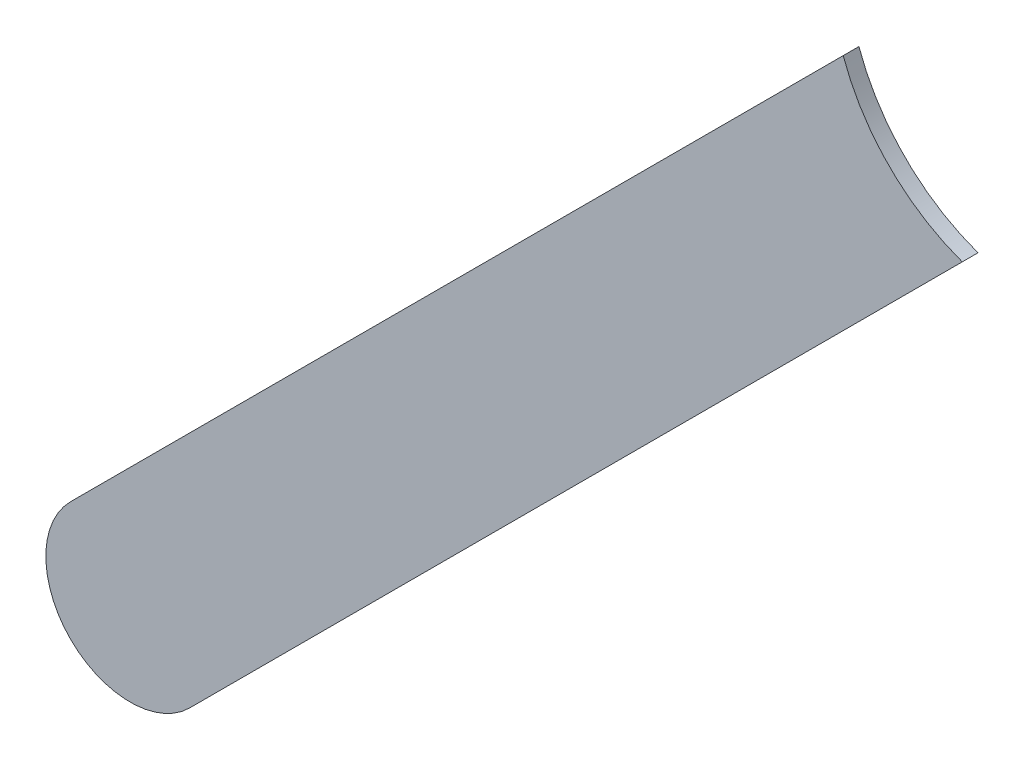
ISO-10303-21;
HEADER;
FILE_DESCRIPTION(('STEP AP214'),'2;1');
FILE_NAME('part.step','',(''),(''),'','','');
FILE_SCHEMA(('AUTOMOTIVE_DESIGN { 1 0 10303 214 1 1 1 1 }'));
ENDSEC;
DATA;
#1=APPLICATION_CONTEXT('core data for automotive mechanical design processes');
#2=APPLICATION_PROTOCOL_DEFINITION('international standard','automotive_design',2000,#1);
#3=PRODUCT_CONTEXT('',#1,'mechanical');
#4=PRODUCT('Part','Part','',(#3));
#5=PRODUCT_RELATED_PRODUCT_CATEGORY('part','',(#4));
#6=PRODUCT_DEFINITION_FORMATION('','',#4);
#7=PRODUCT_DEFINITION_CONTEXT('part definition',#1,'design');
#8=PRODUCT_DEFINITION('design','',#6,#7);
#9=PRODUCT_DEFINITION_SHAPE('','',#8);
#10=(LENGTH_UNIT() NAMED_UNIT(*) SI_UNIT(.MILLI.,.METRE.));
#11=(NAMED_UNIT(*) PLANE_ANGLE_UNIT() SI_UNIT($,.RADIAN.));
#12=(NAMED_UNIT(*) SI_UNIT($,.STERADIAN.) SOLID_ANGLE_UNIT());
#13=UNCERTAINTY_MEASURE_WITH_UNIT(LENGTH_MEASURE(1.E-05),#10,'distance_accuracy_value','');
#14=(GEOMETRIC_REPRESENTATION_CONTEXT(3) GLOBAL_UNCERTAINTY_ASSIGNED_CONTEXT((#13)) GLOBAL_UNIT_ASSIGNED_CONTEXT((#10,
#11,#12)) REPRESENTATION_CONTEXT('',''));
#15=CARTESIAN_POINT('',(0.,0.,0.));
#16=DIRECTION('',(0.,0.,1.));
#17=DIRECTION('',(1.,0.,0.));
#18=AXIS2_PLACEMENT_3D('',#15,#16,#17);
#19=CARTESIAN_POINT('',(29.337,11.303,0.));
#20=DIRECTION('',(0.,0.,-1.));
#21=DIRECTION('',(-0.707106781186552,0.707106781186543,0.));
#22=AXIS2_PLACEMENT_3D('',#19,#20,#21);
#23=CYLINDRICAL_SURFACE('',#22,0.190499969147466);
#24=CARTESIAN_POINT('',(29.337,11.303,0.03556));
#25=DIRECTION('',(0.,0.,1.));
#26=DIRECTION('',(-0.707106781186552,0.707106781186543,0.));
#27=AXIS2_PLACEMENT_3D('',#24,#25,#26);
#28=CIRCLE('',#27,0.190499969147466);
#29=CARTESIAN_POINT('',(29.20229618,11.43770382,0.03556));
#30=VERTEX_POINT('',#29);
#31=CARTESIAN_POINT('',(29.47170382,11.16829618,0.03556));
#32=VERTEX_POINT('',#31);
#33=EDGE_CURVE('E11',#30,#32,#28,.T.);
#34=ORIENTED_EDGE('',*,*,#33,.F.);
#35=DIRECTION('',(0.,0.,1.));
#36=VECTOR('',#35,1.);
#37=CARTESIAN_POINT('',(29.20229618,11.43770382,0.));
#38=LINE('',#37,#36);
#39=CARTESIAN_POINT('',(29.20229618,11.43770382,0.));
#40=VERTEX_POINT('',#39);
#41=EDGE_CURVE('E23',#40,#30,#38,.T.);
#42=ORIENTED_EDGE('',*,*,#41,.F.);
#43=CARTESIAN_POINT('',(29.337,11.303,0.));
#44=DIRECTION('',(0.,0.,1.));
#45=DIRECTION('',(-0.707106781186552,0.707106781186543,0.));
#46=AXIS2_PLACEMENT_3D('',#43,#44,#45);
#47=CIRCLE('',#46,0.190499969147466);
#48=CARTESIAN_POINT('',(29.47170382,11.16829618,0.));
#49=VERTEX_POINT('',#48);
#50=EDGE_CURVE('E87',#40,#49,#47,.T.);
#51=ORIENTED_EDGE('',*,*,#50,.T.);
#52=DIRECTION('',(0.,0.,1.));
#53=VECTOR('',#52,1.);
#54=CARTESIAN_POINT('',(29.47170382,11.16829618,0.));
#55=LINE('',#54,#53);
#56=EDGE_CURVE('E36',#49,#32,#55,.T.);
#57=ORIENTED_EDGE('',*,*,#56,.T.);
#58=EDGE_LOOP('',(#34,#42,#51,#57));
#59=FACE_BOUND('',#58,.T.);
#60=ADVANCED_FACE('F16',(#59),#23,.T.);
#61=CARTESIAN_POINT('',(30.9503155365093,13.1857231765093,0.));
#62=DIRECTION('',(0.707106781186547,-0.707106781186548,0.));
#63=DIRECTION('',(-0.707106781186548,-0.707106781186547,0.));
#64=AXIS2_PLACEMENT_3D('',#61,#62,#63);
#65=PLANE('',#64);
#66=DIRECTION('',(-0.707106781186548,-0.707106781186547,0.));
#67=VECTOR('',#66,1.);
#68=CARTESIAN_POINT('',(31.23429618,13.46970382,0.03556));
#69=LINE('',#68,#67);
#70=CARTESIAN_POINT('',(30.9503155365093,13.1857231765093,0.03556));
#71=VERTEX_POINT('',#70);
#72=EDGE_CURVE('E83',#71,#30,#69,.T.);
#73=ORIENTED_EDGE('',*,*,#72,.F.);
#74=DIRECTION('',(0.,0.,1.));
#75=VECTOR('',#74,1.);
#76=CARTESIAN_POINT('',(30.9503155365093,13.1857231765093,0.));
#77=LINE('',#76,#75);
#78=CARTESIAN_POINT('',(30.9503155365093,13.1857231765093,0.));
#79=VERTEX_POINT('',#78);
#80=EDGE_CURVE('E81',#79,#71,#77,.T.);
#81=ORIENTED_EDGE('',*,*,#80,.F.);
#82=DIRECTION('',(-0.707106781186548,-0.707106781186547,0.));
#83=VECTOR('',#82,1.);
#84=CARTESIAN_POINT('',(31.23429618,13.46970382,0.));
#85=LINE('',#84,#83);
#86=EDGE_CURVE('E72',#79,#40,#85,.T.);
#87=ORIENTED_EDGE('',*,*,#86,.T.);
#88=ORIENTED_EDGE('',*,*,#41,.T.);
#89=EDGE_LOOP('',(#73,#81,#87,#88));
#90=FACE_BOUND('',#89,.T.);
#91=ADVANCED_FACE('F88',(#90),#65,.F.);
#92=CARTESIAN_POINT('',(31.369,13.335,0.));
#93=DIRECTION('',(0.,0.,-1.));
#94=DIRECTION('',(1.,0.,0.));
#95=AXIS2_PLACEMENT_3D('',#92,#93,#94);
#96=CYLINDRICAL_SURFACE('',#95,0.4445);
#97=ORIENTED_EDGE('',*,*,#80,.T.);
#98=CARTESIAN_POINT('',(31.369,13.335,0.03556));
#99=DIRECTION('',(0.,0.,1.));
#100=DIRECTION('',(1.,0.,0.));
#101=AXIS2_PLACEMENT_3D('',#98,#99,#100);
#102=CIRCLE('',#101,0.4445);
#103=CARTESIAN_POINT('',(31.2197231765093,12.9163155365093,0.03556));
#104=VERTEX_POINT('',#103);
#105=EDGE_CURVE('E60',#71,#104,#102,.T.);
#106=ORIENTED_EDGE('',*,*,#105,.T.);
#107=DIRECTION('',(0.,0.,1.));
#108=VECTOR('',#107,1.);
#109=CARTESIAN_POINT('',(31.2197231765093,12.9163155365093,0.));
#110=LINE('',#109,#108);
#111=CARTESIAN_POINT('',(31.2197231765093,12.9163155365093,0.));
#112=VERTEX_POINT('',#111);
#113=EDGE_CURVE('E55',#112,#104,#110,.T.);
#114=ORIENTED_EDGE('',*,*,#113,.F.);
#115=CARTESIAN_POINT('',(31.369,13.335,0.));
#116=DIRECTION('',(0.,0.,1.));
#117=DIRECTION('',(1.,0.,0.));
#118=AXIS2_PLACEMENT_3D('',#115,#116,#117);
#119=CIRCLE('',#118,0.4445);
#120=EDGE_CURVE('E58',#79,#112,#119,.T.);
#121=ORIENTED_EDGE('',*,*,#120,.F.);
#122=EDGE_LOOP('',(#97,#106,#114,#121));
#123=FACE_BOUND('',#122,.T.);
#124=ADVANCED_FACE('F57',(#123),#96,.F.);
#125=CARTESIAN_POINT('',(29.47170382,11.16829618,0.));
#126=DIRECTION('',(-0.707106781186548,0.707106781186548,0.));
#127=DIRECTION('',(0.707106781186548,0.707106781186548,0.));
#128=AXIS2_PLACEMENT_3D('',#125,#126,#127);
#129=PLANE('',#128);
#130=DIRECTION('',(0.707106781186548,0.707106781186548,0.));
#131=VECTOR('',#130,1.);
#132=CARTESIAN_POINT('',(29.47170382,11.16829618,0.03556));
#133=LINE('',#132,#131);
#134=EDGE_CURVE('E73',#32,#104,#133,.T.);
#135=ORIENTED_EDGE('',*,*,#134,.F.);
#136=ORIENTED_EDGE('',*,*,#56,.F.);
#137=DIRECTION('',(0.707106781186548,0.707106781186548,0.));
#138=VECTOR('',#137,1.);
#139=CARTESIAN_POINT('',(29.47170382,11.16829618,0.));
#140=LINE('',#139,#138);
#141=EDGE_CURVE('E71',#49,#112,#140,.T.);
#142=ORIENTED_EDGE('',*,*,#141,.T.);
#143=ORIENTED_EDGE('',*,*,#113,.T.);
#144=EDGE_LOOP('',(#135,#136,#142,#143));
#145=FACE_BOUND('',#144,.T.);
#146=ADVANCED_FACE('F75',(#145),#129,.F.);
#147=CARTESIAN_POINT('',(30.353,12.319,0.));
#148=DIRECTION('',(0.,0.,1.));
#149=DIRECTION('',(1.,0.,0.));
#150=AXIS2_PLACEMENT_3D('',#147,#148,#149);
#151=PLANE('',#150);
#152=ORIENTED_EDGE('',*,*,#141,.F.);
#153=ORIENTED_EDGE('',*,*,#50,.F.);
#154=ORIENTED_EDGE('',*,*,#86,.F.);
#155=ORIENTED_EDGE('',*,*,#120,.T.);
#156=EDGE_LOOP('',(#152,#153,#154,#155));
#157=FACE_BOUND('',#156,.T.);
#158=ADVANCED_FACE('F69',(#157),#151,.F.);
#159=CARTESIAN_POINT('',(30.353,12.319,0.03556));
#160=DIRECTION('',(0.,0.,1.));
#161=DIRECTION('',(1.,0.,0.));
#162=AXIS2_PLACEMENT_3D('',#159,#160,#161);
#163=PLANE('',#162);
#164=ORIENTED_EDGE('',*,*,#33,.T.);
#165=ORIENTED_EDGE('',*,*,#134,.T.);
#166=ORIENTED_EDGE('',*,*,#105,.F.);
#167=ORIENTED_EDGE('',*,*,#72,.T.);
#168=EDGE_LOOP('',(#164,#165,#166,#167));
#169=FACE_BOUND('',#168,.T.);
#170=ADVANCED_FACE('F90',(#169),#163,.T.);
#171=CLOSED_SHELL('',(#60,#91,#124,#146,#158,#170));
#172=MANIFOLD_SOLID_BREP('B1',#171);
#173=ADVANCED_BREP_SHAPE_REPRESENTATION('',(#18,#172),#14);
#174=SHAPE_DEFINITION_REPRESENTATION(#9,#173);
ENDSEC;
END-ISO-10303-21;
